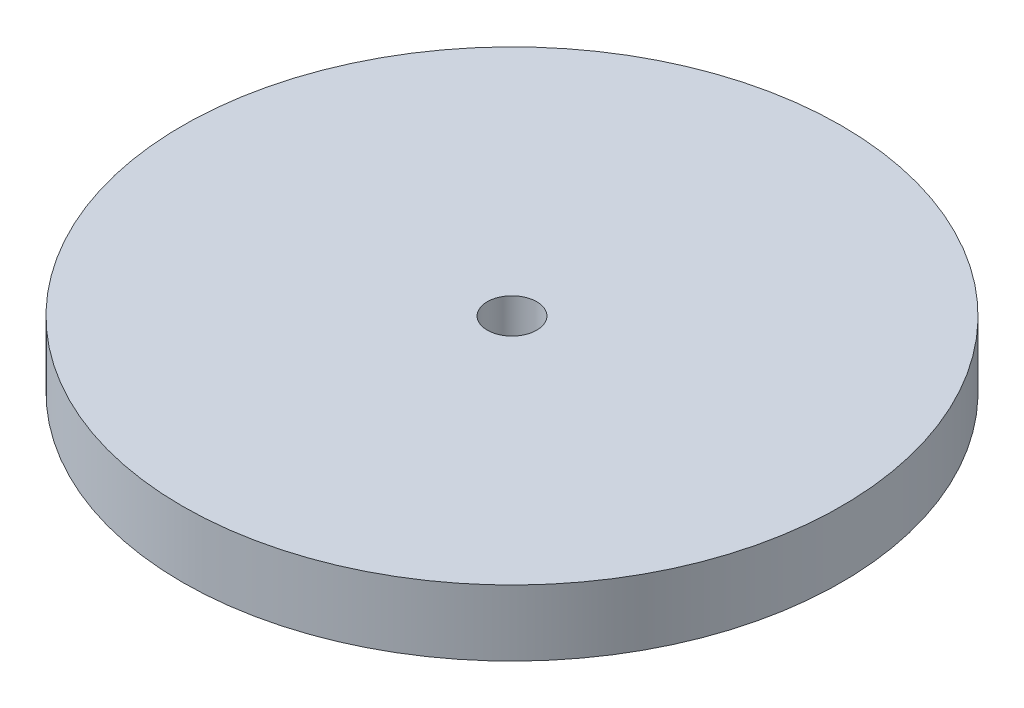
ISO-10303-21;
HEADER;
FILE_DESCRIPTION(('STEP AP214'),'2;1');
FILE_NAME('part.step','',(''),(''),'','','');
FILE_SCHEMA(('AUTOMOTIVE_DESIGN { 1 0 10303 214 1 1 1 1 }'));
ENDSEC;
DATA;
#1=APPLICATION_CONTEXT('core data for automotive mechanical design processes');
#2=APPLICATION_PROTOCOL_DEFINITION('international standard','automotive_design',2000,#1);
#3=PRODUCT_CONTEXT('',#1,'mechanical');
#4=PRODUCT('Part','Part','',(#3));
#5=PRODUCT_RELATED_PRODUCT_CATEGORY('part','',(#4));
#6=PRODUCT_DEFINITION_FORMATION('','',#4);
#7=PRODUCT_DEFINITION_CONTEXT('part definition',#1,'design');
#8=PRODUCT_DEFINITION('design','',#6,#7);
#9=PRODUCT_DEFINITION_SHAPE('','',#8);
#10=(LENGTH_UNIT() NAMED_UNIT(*) SI_UNIT(.MILLI.,.METRE.));
#11=(NAMED_UNIT(*) PLANE_ANGLE_UNIT() SI_UNIT($,.RADIAN.));
#12=(NAMED_UNIT(*) SI_UNIT($,.STERADIAN.) SOLID_ANGLE_UNIT());
#13=UNCERTAINTY_MEASURE_WITH_UNIT(LENGTH_MEASURE(1.E-05),#10,'distance_accuracy_value','');
#14=(GEOMETRIC_REPRESENTATION_CONTEXT(3) GLOBAL_UNCERTAINTY_ASSIGNED_CONTEXT((#13)) GLOBAL_UNIT_ASSIGNED_CONTEXT((#10,
#11,#12)) REPRESENTATION_CONTEXT('',''));
#15=CARTESIAN_POINT('',(0.,0.,0.));
#16=DIRECTION('',(0.,0.,1.));
#17=DIRECTION('',(1.,0.,0.));
#18=AXIS2_PLACEMENT_3D('',#15,#16,#17);
#19=CARTESIAN_POINT('',(0.,2.,0.));
#20=DIRECTION('',(0.,-1.,0.));
#21=DIRECTION('',(0.,0.,-1.));
#22=AXIS2_PLACEMENT_3D('',#19,#20,#21);
#23=CYLINDRICAL_SURFACE('',#22,10.);
#24=CARTESIAN_POINT('',(0.,2.,0.));
#25=DIRECTION('',(0.,1.,0.));
#26=DIRECTION('',(0.,0.,1.));
#27=AXIS2_PLACEMENT_3D('',#24,#25,#26);
#28=CIRCLE('',#27,10.);
#29=CARTESIAN_POINT('',(0.,2.,10.));
#30=VERTEX_POINT('',#29);
#31=EDGE_CURVE('E10',#30,#30,#28,.T.);
#32=ORIENTED_EDGE('',*,*,#31,.F.);
#33=EDGE_LOOP('',(#32));
#34=FACE_BOUND('',#33,.T.);
#35=CARTESIAN_POINT('',(0.,0.,0.));
#36=DIRECTION('',(0.,1.,0.));
#37=DIRECTION('',(0.,0.,1.));
#38=AXIS2_PLACEMENT_3D('',#35,#36,#37);
#39=CIRCLE('',#38,10.);
#40=CARTESIAN_POINT('',(0.,0.,10.));
#41=VERTEX_POINT('',#40);
#42=EDGE_CURVE('E38',#41,#41,#39,.T.);
#43=ORIENTED_EDGE('',*,*,#42,.T.);
#44=EDGE_LOOP('',(#43));
#45=FACE_BOUND('',#44,.T.);
#46=ADVANCED_FACE('F35',(#34,#45),#23,.T.);
#47=CARTESIAN_POINT('',(0.,2.,0.));
#48=DIRECTION('',(0.,1.,0.));
#49=DIRECTION('',(0.,0.,1.));
#50=AXIS2_PLACEMENT_3D('',#47,#48,#49);
#51=PLANE('',#50);
#52=CARTESIAN_POINT('',(0.,2.,0.));
#53=DIRECTION('',(0.,1.,0.));
#54=DIRECTION('',(0.,0.,1.));
#55=AXIS2_PLACEMENT_3D('',#52,#53,#54);
#56=CIRCLE('',#55,0.75);
#57=CARTESIAN_POINT('',(0.,2.,0.75));
#58=VERTEX_POINT('',#57);
#59=EDGE_CURVE('E47',#58,#58,#56,.T.);
#60=ORIENTED_EDGE('',*,*,#59,.F.);
#61=EDGE_LOOP('',(#60));
#62=FACE_BOUND('',#61,.T.);
#63=ORIENTED_EDGE('',*,*,#31,.T.);
#64=EDGE_LOOP('',(#63));
#65=FACE_BOUND('',#64,.T.);
#66=ADVANCED_FACE('F62',(#62,#65),#51,.T.);
#67=CARTESIAN_POINT('',(0.,0.,0.));
#68=DIRECTION('',(0.,1.,0.));
#69=DIRECTION('',(0.,0.,1.));
#70=AXIS2_PLACEMENT_3D('',#67,#68,#69);
#71=PLANE('',#70);
#72=CARTESIAN_POINT('',(0.,0.,0.));
#73=DIRECTION('',(0.,1.,0.));
#74=DIRECTION('',(0.,0.,1.));
#75=AXIS2_PLACEMENT_3D('',#72,#73,#74);
#76=CIRCLE('',#75,0.75);
#77=CARTESIAN_POINT('',(0.,0.,0.75));
#78=VERTEX_POINT('',#77);
#79=EDGE_CURVE('E45',#78,#78,#76,.T.);
#80=ORIENTED_EDGE('',*,*,#79,.T.);
#81=EDGE_LOOP('',(#80));
#82=FACE_BOUND('',#81,.T.);
#83=ORIENTED_EDGE('',*,*,#42,.F.);
#84=EDGE_LOOP('',(#83));
#85=FACE_BOUND('',#84,.T.);
#86=ADVANCED_FACE('F53',(#82,#85),#71,.F.);
#87=CARTESIAN_POINT('',(0.,0.,0.));
#88=DIRECTION('',(0.,1.,0.));
#89=DIRECTION('',(0.,0.,1.));
#90=AXIS2_PLACEMENT_3D('',#87,#88,#89);
#91=CYLINDRICAL_SURFACE('',#90,0.75);
#92=ORIENTED_EDGE('',*,*,#79,.F.);
#93=EDGE_LOOP('',(#92));
#94=FACE_BOUND('',#93,.T.);
#95=ORIENTED_EDGE('',*,*,#59,.T.);
#96=EDGE_LOOP('',(#95));
#97=FACE_BOUND('',#96,.T.);
#98=ADVANCED_FACE('F56',(#94,#97),#91,.F.);
#99=CLOSED_SHELL('',(#46,#66,#86,#98));
#100=MANIFOLD_SOLID_BREP('B2',#99);
#101=ADVANCED_BREP_SHAPE_REPRESENTATION('',(#18,#100),#14);
#102=SHAPE_DEFINITION_REPRESENTATION(#9,#101);
ENDSEC;
END-ISO-10303-21;
